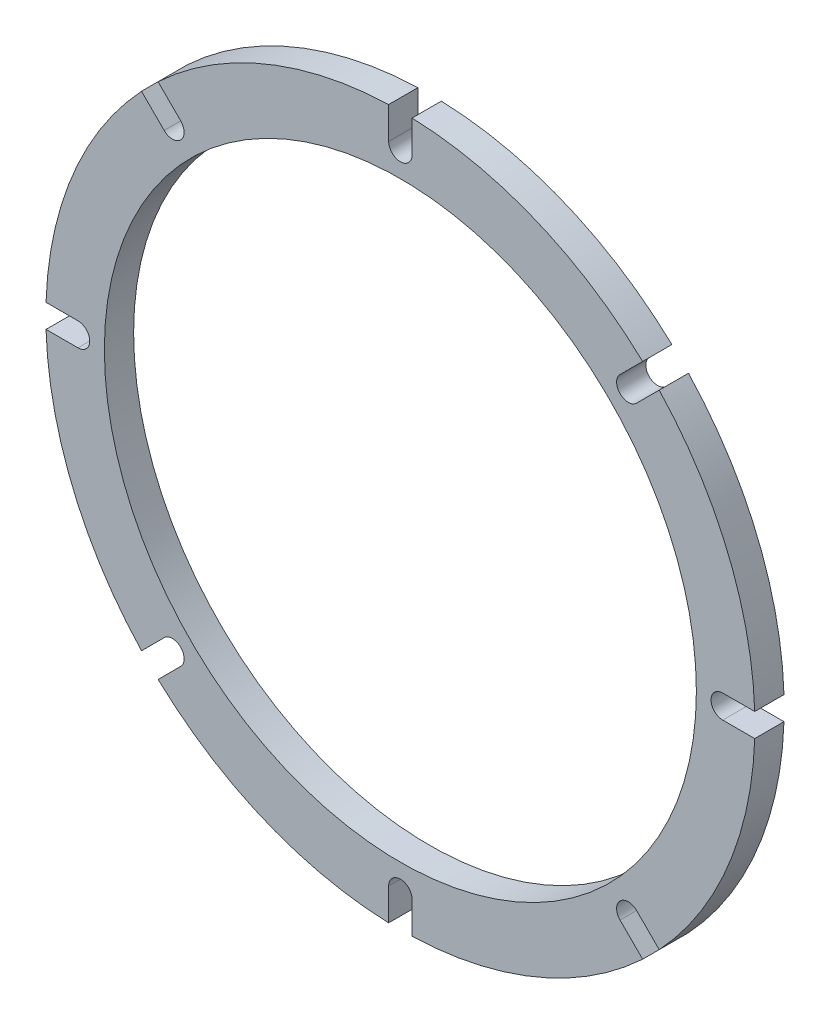
ISO-10303-21;
HEADER;
FILE_DESCRIPTION(('STEP AP214'),'2;1');
FILE_NAME('part.step','',(''),(''),'','','');
FILE_SCHEMA(('AUTOMOTIVE_DESIGN { 1 0 10303 214 1 1 1 1 }'));
ENDSEC;
DATA;
#1=APPLICATION_CONTEXT('core data for automotive mechanical design processes');
#2=APPLICATION_PROTOCOL_DEFINITION('international standard','automotive_design',2000,#1);
#3=PRODUCT_CONTEXT('',#1,'mechanical');
#4=PRODUCT('Part','Part','',(#3));
#5=PRODUCT_RELATED_PRODUCT_CATEGORY('part','',(#4));
#6=PRODUCT_DEFINITION_FORMATION('','',#4);
#7=PRODUCT_DEFINITION_CONTEXT('part definition',#1,'design');
#8=PRODUCT_DEFINITION('design','',#6,#7);
#9=PRODUCT_DEFINITION_SHAPE('','',#8);
#10=(LENGTH_UNIT() NAMED_UNIT(*) SI_UNIT(.MILLI.,.METRE.));
#11=(NAMED_UNIT(*) PLANE_ANGLE_UNIT() SI_UNIT($,.RADIAN.));
#12=(NAMED_UNIT(*) SI_UNIT($,.STERADIAN.) SOLID_ANGLE_UNIT());
#13=UNCERTAINTY_MEASURE_WITH_UNIT(LENGTH_MEASURE(1.E-05),#10,'distance_accuracy_value','');
#14=(GEOMETRIC_REPRESENTATION_CONTEXT(3) GLOBAL_UNCERTAINTY_ASSIGNED_CONTEXT((#13)) GLOBAL_UNIT_ASSIGNED_CONTEXT((#10,
#11,#12)) REPRESENTATION_CONTEXT('',''));
#15=CARTESIAN_POINT('',(0.,0.,0.));
#16=DIRECTION('',(0.,0.,1.));
#17=DIRECTION('',(1.,0.,0.));
#18=AXIS2_PLACEMENT_3D('',#15,#16,#17);
#19=CARTESIAN_POINT('',(0.,0.,10.));
#20=DIRECTION('',(0.,0.,1.));
#21=DIRECTION('',(1.,0.,0.));
#22=AXIS2_PLACEMENT_3D('',#19,#20,#21);
#23=PLANE('',#22);
#24=CARTESIAN_POINT('',(0.,0.,10.));
#25=DIRECTION('',(0.,0.,1.));
#26=DIRECTION('',(1.,0.,0.));
#27=AXIS2_PLACEMENT_3D('',#24,#25,#26);
#28=CIRCLE('',#27,101.15);
#29=CARTESIAN_POINT('',(101.15,0.,10.));
#30=VERTEX_POINT('',#29);
#31=EDGE_CURVE('E415',#30,#30,#28,.T.);
#32=ORIENTED_EDGE('',*,*,#31,.F.);
#33=EDGE_LOOP('',(#32));
#34=FACE_BOUND('',#33,.T.);
#35=CARTESIAN_POINT('',(0.,0.,10.));
#36=DIRECTION('',(0.,0.,1.));
#37=DIRECTION('',(1.,0.,0.));
#38=AXIS2_PLACEMENT_3D('',#35,#36,#37);
#39=CIRCLE('',#38,121.15);
#40=CARTESIAN_POINT('',(121.083948151685,4.00000000000127,10.));
#41=VERTEX_POINT('',#40);
#42=CARTESIAN_POINT('',(88.4477079556421,82.7908537061518,10.));
#43=VERTEX_POINT('',#42);
#44=EDGE_CURVE('E266',#41,#43,#39,.T.);
#45=ORIENTED_EDGE('',*,*,#44,.T.);
#46=DIRECTION('',(0.707106781186539,0.707106781186556,0.));
#47=VECTOR('',#46,1.);
#48=CARTESIAN_POINT('',(90.4049958559674,84.7481416064772,10.));
#49=LINE('',#48,#47);
#50=CARTESIAN_POINT('',(80.7162390724435,75.059384822953,10.));
#51=VERTEX_POINT('',#50);
#52=EDGE_CURVE('E254',#51,#43,#49,.T.);
#53=ORIENTED_EDGE('',*,*,#52,.F.);
#54=CARTESIAN_POINT('',(77.8878119476973,77.8878119476992,10.));
#55=DIRECTION('',(0.,0.,1.));
#56=DIRECTION('',(0.707106781186556,-0.707106781186539,0.));
#57=AXIS2_PLACEMENT_3D('',#54,#55,#56);
#58=CIRCLE('',#57,4.);
#59=CARTESIAN_POINT('',(75.059384822951,80.7162390724453,10.));
#60=VERTEX_POINT('',#59);
#61=EDGE_CURVE('E244',#60,#51,#58,.T.);
#62=ORIENTED_EDGE('',*,*,#61,.F.);
#63=DIRECTION('',(-0.707106781186539,-0.707106781186556,0.));
#64=VECTOR('',#63,1.);
#65=CARTESIAN_POINT('',(75.059384822951,80.7162390724453,10.));
#66=LINE('',#65,#64);
#67=CARTESIAN_POINT('',(82.7908537061497,88.4477079556441,10.));
#68=VERTEX_POINT('',#67);
#69=EDGE_CURVE('E267',#68,#60,#66,.T.);
#70=ORIENTED_EDGE('',*,*,#69,.F.);
#71=CARTESIAN_POINT('',(4.,121.083948151685,10.));
#72=VERTEX_POINT('',#71);
#73=EDGE_CURVE('E426',#68,#72,#39,.T.);
#74=ORIENTED_EDGE('',*,*,#73,.T.);
#75=DIRECTION('',(0.,1.,0.));
#76=VECTOR('',#75,1.);
#77=CARTESIAN_POINT('',(4.,123.851971245794,10.));
#78=LINE('',#77,#76);
#79=CARTESIAN_POINT('',(4.,110.15,10.));
#80=VERTEX_POINT('',#79);
#81=EDGE_CURVE('E396',#80,#72,#78,.T.);
#82=ORIENTED_EDGE('',*,*,#81,.F.);
#83=CARTESIAN_POINT('',(0.,110.15,10.));
#84=DIRECTION('',(0.,0.,1.));
#85=DIRECTION('',(1.,0.,0.));
#86=AXIS2_PLACEMENT_3D('',#83,#84,#85);
#87=CIRCLE('',#86,4.);
#88=CARTESIAN_POINT('',(-4.,110.15,10.));
#89=VERTEX_POINT('',#88);
#90=EDGE_CURVE('E394',#89,#80,#87,.T.);
#91=ORIENTED_EDGE('',*,*,#90,.F.);
#92=DIRECTION('',(0.,-1.,0.));
#93=VECTOR('',#92,1.);
#94=CARTESIAN_POINT('',(-4.,110.15,10.));
#95=LINE('',#94,#93);
#96=CARTESIAN_POINT('',(-4.,121.083948151685,10.));
#97=VERTEX_POINT('',#96);
#98=EDGE_CURVE('E400',#97,#89,#95,.T.);
#99=ORIENTED_EDGE('',*,*,#98,.F.);
#100=CARTESIAN_POINT('',(-82.7908537061509,88.447707955643,10.));
#101=VERTEX_POINT('',#100);
#102=EDGE_CURVE('E421',#97,#101,#39,.T.);
#103=ORIENTED_EDGE('',*,*,#102,.T.);
#104=DIRECTION('',(-0.707106781186549,0.707106781186546,0.));
#105=VECTOR('',#104,1.);
#106=CARTESIAN_POINT('',(-84.7481416064763,90.4049958559683,10.));
#107=LINE('',#106,#105);
#108=CARTESIAN_POINT('',(-75.0593848229522,80.7162390724443,10.));
#109=VERTEX_POINT('',#108);
#110=EDGE_CURVE('E376',#109,#101,#107,.T.);
#111=ORIENTED_EDGE('',*,*,#110,.F.);
#112=CARTESIAN_POINT('',(-77.8878119476984,77.8878119476981,10.));
#113=DIRECTION('',(0.,0.,1.));
#114=DIRECTION('',(0.707106781186546,0.707106781186549,0.));
#115=AXIS2_PLACEMENT_3D('',#112,#113,#114);
#116=CIRCLE('',#115,4.);
#117=CARTESIAN_POINT('',(-80.7162390724445,75.0593848229519,10.));
#118=VERTEX_POINT('',#117);
#119=EDGE_CURVE('E374',#118,#109,#116,.T.);
#120=ORIENTED_EDGE('',*,*,#119,.F.);
#121=DIRECTION('',(0.707106781186549,-0.707106781186546,0.));
#122=VECTOR('',#121,1.);
#123=CARTESIAN_POINT('',(-80.7162390724445,75.0593848229519,10.));
#124=LINE('',#123,#122);
#125=CARTESIAN_POINT('',(-88.4477079556433,82.7908537061506,10.));
#126=VERTEX_POINT('',#125);
#127=EDGE_CURVE('E379',#126,#118,#124,.T.);
#128=ORIENTED_EDGE('',*,*,#127,.F.);
#129=CARTESIAN_POINT('',(-121.083948151685,3.99999999999958,10.));
#130=VERTEX_POINT('',#129);
#131=EDGE_CURVE('E425',#126,#130,#39,.T.);
#132=ORIENTED_EDGE('',*,*,#131,.T.);
#133=DIRECTION('',(-1.,0.,0.));
#134=VECTOR('',#133,1.);
#135=CARTESIAN_POINT('',(-123.851971245794,3.99999999999957,10.));
#136=LINE('',#135,#134);
#137=CARTESIAN_POINT('',(-110.15,3.99999999999962,10.));
#138=VERTEX_POINT('',#137);
#139=EDGE_CURVE('E356',#138,#130,#136,.T.);
#140=ORIENTED_EDGE('',*,*,#139,.F.);
#141=CARTESIAN_POINT('',(-110.15,-3.84586669473571E-13,10.));
#142=DIRECTION('',(0.,0.,1.));
#143=DIRECTION('',(0.,1.,0.));
#144=AXIS2_PLACEMENT_3D('',#141,#142,#143);
#145=CIRCLE('',#144,4.);
#146=CARTESIAN_POINT('',(-110.15,-4.00000000000039,10.));
#147=VERTEX_POINT('',#146);
#148=EDGE_CURVE('E354',#147,#138,#145,.T.);
#149=ORIENTED_EDGE('',*,*,#148,.F.);
#150=DIRECTION('',(1.,0.,0.));
#151=VECTOR('',#150,1.);
#152=CARTESIAN_POINT('',(-110.15,-4.00000000000039,10.));
#153=LINE('',#152,#151);
#154=CARTESIAN_POINT('',(-121.083948151685,-4.00000000000042,10.));
#155=VERTEX_POINT('',#154);
#156=EDGE_CURVE('E359',#155,#147,#153,.T.);
#157=ORIENTED_EDGE('',*,*,#156,.F.);
#158=CARTESIAN_POINT('',(-88.4477079556427,-82.7908537061512,10.));
#159=VERTEX_POINT('',#158);
#160=EDGE_CURVE('E477',#155,#159,#39,.T.);
#161=ORIENTED_EDGE('',*,*,#160,.T.);
#162=DIRECTION('',(-0.707106781186544,-0.707106781186551,0.));
#163=VECTOR('',#162,1.);
#164=CARTESIAN_POINT('',(-90.404995855968,-84.7481416064766,10.));
#165=LINE('',#164,#163);
#166=CARTESIAN_POINT('',(-80.716239072444,-75.0593848229525,10.));
#167=VERTEX_POINT('',#166);
#168=EDGE_CURVE('E336',#167,#159,#165,.T.);
#169=ORIENTED_EDGE('',*,*,#168,.F.);
#170=CARTESIAN_POINT('',(-77.8878119476978,-77.8878119476986,10.));
#171=DIRECTION('',(0.,0.,1.));
#172=DIRECTION('',(-0.707106781186551,0.707106781186544,0.));
#173=AXIS2_PLACEMENT_3D('',#170,#171,#172);
#174=CIRCLE('',#173,4.);
#175=CARTESIAN_POINT('',(-75.0593848229516,-80.7162390724448,10.));
#176=VERTEX_POINT('',#175);
#177=EDGE_CURVE('E334',#176,#167,#174,.T.);
#178=ORIENTED_EDGE('',*,*,#177,.F.);
#179=DIRECTION('',(0.707106781186544,0.707106781186551,0.));
#180=VECTOR('',#179,1.);
#181=CARTESIAN_POINT('',(-75.0593848229516,-80.7162390724448,10.));
#182=LINE('',#181,#180);
#183=CARTESIAN_POINT('',(-82.7908537061503,-88.4477079556436,10.));
#184=VERTEX_POINT('',#183);
#185=EDGE_CURVE('E339',#184,#176,#182,.T.);
#186=ORIENTED_EDGE('',*,*,#185,.F.);
#187=CARTESIAN_POINT('',(-4.,-121.083948151685,10.));
#188=VERTEX_POINT('',#187);
#189=EDGE_CURVE('E472',#184,#188,#39,.T.);
#190=ORIENTED_EDGE('',*,*,#189,.T.);
#191=DIRECTION('',(0.,-1.,0.));
#192=VECTOR('',#191,1.);
#193=CARTESIAN_POINT('',(-4.,-123.851971245794,10.));
#194=LINE('',#193,#192);
#195=CARTESIAN_POINT('',(-4.,-110.15,10.));
#196=VERTEX_POINT('',#195);
#197=EDGE_CURVE('E316',#196,#188,#194,.T.);
#198=ORIENTED_EDGE('',*,*,#197,.F.);
#199=CARTESIAN_POINT('',(0.,-110.15,10.));
#200=DIRECTION('',(0.,0.,1.));
#201=DIRECTION('',(-1.,0.,0.));
#202=AXIS2_PLACEMENT_3D('',#199,#200,#201);
#203=CIRCLE('',#202,4.);
#204=CARTESIAN_POINT('',(4.,-110.15,10.));
#205=VERTEX_POINT('',#204);
#206=EDGE_CURVE('E314',#205,#196,#203,.T.);
#207=ORIENTED_EDGE('',*,*,#206,.F.);
#208=DIRECTION('',(0.,1.,0.));
#209=VECTOR('',#208,1.);
#210=CARTESIAN_POINT('',(4.,-110.15,10.));
#211=LINE('',#210,#209);
#212=CARTESIAN_POINT('',(4.,-121.083948151685,10.));
#213=VERTEX_POINT('',#212);
#214=EDGE_CURVE('E319',#213,#205,#211,.T.);
#215=ORIENTED_EDGE('',*,*,#214,.F.);
#216=CARTESIAN_POINT('',(82.7908537061515,-88.4477079556424,10.));
#217=VERTEX_POINT('',#216);
#218=EDGE_CURVE('E467',#213,#217,#39,.T.);
#219=ORIENTED_EDGE('',*,*,#218,.T.);
#220=DIRECTION('',(0.707106781186554,-0.707106781186541,0.));
#221=VECTOR('',#220,1.);
#222=CARTESIAN_POINT('',(84.7481416064769,-90.4049958559677,10.));
#223=LINE('',#222,#221);
#224=CARTESIAN_POINT('',(75.0593848229527,-80.7162390724438,10.));
#225=VERTEX_POINT('',#224);
#226=EDGE_CURVE('E296',#225,#217,#223,.T.);
#227=ORIENTED_EDGE('',*,*,#226,.F.);
#228=CARTESIAN_POINT('',(77.8878119476989,-77.8878119476975,10.));
#229=DIRECTION('',(0.,0.,1.));
#230=DIRECTION('',(-0.707106781186541,-0.707106781186554,0.));
#231=AXIS2_PLACEMENT_3D('',#228,#229,#230);
#232=CIRCLE('',#231,4.);
#233=CARTESIAN_POINT('',(80.7162390724451,-75.0593848229513,10.));
#234=VERTEX_POINT('',#233);
#235=EDGE_CURVE('E294',#234,#225,#232,.T.);
#236=ORIENTED_EDGE('',*,*,#235,.F.);
#237=DIRECTION('',(-0.707106781186554,0.707106781186541,0.));
#238=VECTOR('',#237,1.);
#239=CARTESIAN_POINT('',(80.7162390724451,-75.0593848229513,10.));
#240=LINE('',#239,#238);
#241=CARTESIAN_POINT('',(88.4477079556439,-82.79085370615,10.));
#242=VERTEX_POINT('',#241);
#243=EDGE_CURVE('E299',#242,#234,#240,.T.);
#244=ORIENTED_EDGE('',*,*,#243,.F.);
#245=CARTESIAN_POINT('',(121.083948151685,-3.99999999999873,10.));
#246=VERTEX_POINT('',#245);
#247=EDGE_CURVE('E465',#242,#246,#39,.T.);
#248=ORIENTED_EDGE('',*,*,#247,.T.);
#249=DIRECTION('',(1.,0.,0.));
#250=VECTOR('',#249,1.);
#251=CARTESIAN_POINT('',(123.851971245794,-3.9999999999987,10.));
#252=LINE('',#251,#250);
#253=CARTESIAN_POINT('',(110.15,-3.99999999999885,10.));
#254=VERTEX_POINT('',#253);
#255=EDGE_CURVE('E278',#254,#246,#252,.T.);
#256=ORIENTED_EDGE('',*,*,#255,.F.);
#257=CARTESIAN_POINT('',(110.15,1.15376000842071E-12,10.));
#258=DIRECTION('',(0.,0.,1.));
#259=DIRECTION('',(0.,-1.,0.));
#260=AXIS2_PLACEMENT_3D('',#257,#258,#259);
#261=CIRCLE('',#260,4.);
#262=CARTESIAN_POINT('',(110.15,4.00000000000115,10.));
#263=VERTEX_POINT('',#262);
#264=EDGE_CURVE('E276',#263,#254,#261,.T.);
#265=ORIENTED_EDGE('',*,*,#264,.F.);
#266=DIRECTION('',(-1.,0.,0.));
#267=VECTOR('',#266,1.);
#268=CARTESIAN_POINT('',(110.15,4.00000000000115,10.));
#269=LINE('',#268,#267);
#270=EDGE_CURVE('E280',#41,#263,#269,.T.);
#271=ORIENTED_EDGE('',*,*,#270,.F.);
#272=EDGE_LOOP('',(#45,#53,#62,#70,#74,#82,#91,#99,#103,#111,#120,#128,#132,#140,#149,#157,#161,
#169,#178,#186,#190,#198,#207,#215,#219,#227,#236,#244,#248,#256,#265,#271));
#273=FACE_BOUND('',#272,.T.);
#274=ADVANCED_FACE('F35',(#34,#273),#23,.T.);
#275=CARTESIAN_POINT('',(0.,0.,0.));
#276=DIRECTION('',(0.,0.,1.));
#277=DIRECTION('',(1.,0.,0.));
#278=AXIS2_PLACEMENT_3D('',#275,#276,#277);
#279=PLANE('',#278);
#280=CARTESIAN_POINT('',(0.,0.,0.));
#281=DIRECTION('',(0.,0.,1.));
#282=DIRECTION('',(1.,0.,0.));
#283=AXIS2_PLACEMENT_3D('',#280,#281,#282);
#284=CIRCLE('',#283,101.15);
#285=CARTESIAN_POINT('',(101.15,0.,0.));
#286=VERTEX_POINT('',#285);
#287=EDGE_CURVE('E414',#286,#286,#284,.T.);
#288=ORIENTED_EDGE('',*,*,#287,.T.);
#289=EDGE_LOOP('',(#288));
#290=FACE_BOUND('',#289,.T.);
#291=DIRECTION('',(0.707106781186539,0.707106781186556,0.));
#292=VECTOR('',#291,1.);
#293=CARTESIAN_POINT('',(90.4049958559674,84.7481416064772,0.));
#294=LINE('',#293,#292);
#295=CARTESIAN_POINT('',(80.7162390724435,75.059384822953,0.));
#296=VERTEX_POINT('',#295);
#297=CARTESIAN_POINT('',(88.4477079556421,82.7908537061518,0.));
#298=VERTEX_POINT('',#297);
#299=EDGE_CURVE('E260',#296,#298,#294,.T.);
#300=ORIENTED_EDGE('',*,*,#299,.T.);
#301=CARTESIAN_POINT('',(0.,0.,0.));
#302=DIRECTION('',(0.,0.,1.));
#303=DIRECTION('',(1.,0.,0.));
#304=AXIS2_PLACEMENT_3D('',#301,#302,#303);
#305=CIRCLE('',#304,121.15);
#306=CARTESIAN_POINT('',(121.083948151685,4.00000000000127,0.));
#307=VERTEX_POINT('',#306);
#308=EDGE_CURVE('E574',#307,#298,#305,.T.);
#309=ORIENTED_EDGE('',*,*,#308,.F.);
#310=DIRECTION('',(-1.,0.,0.));
#311=VECTOR('',#310,1.);
#312=CARTESIAN_POINT('',(110.15,4.00000000000115,0.));
#313=LINE('',#312,#311);
#314=CARTESIAN_POINT('',(110.15,4.00000000000115,0.));
#315=VERTEX_POINT('',#314);
#316=EDGE_CURVE('E58',#307,#315,#313,.T.);
#317=ORIENTED_EDGE('',*,*,#316,.T.);
#318=CARTESIAN_POINT('',(110.15,1.15376000842071E-12,0.));
#319=DIRECTION('',(0.,0.,1.));
#320=DIRECTION('',(0.,-1.,0.));
#321=AXIS2_PLACEMENT_3D('',#318,#319,#320);
#322=CIRCLE('',#321,4.);
#323=CARTESIAN_POINT('',(110.15,-3.99999999999885,0.));
#324=VERTEX_POINT('',#323);
#325=EDGE_CURVE('E261',#315,#324,#322,.T.);
#326=ORIENTED_EDGE('',*,*,#325,.T.);
#327=DIRECTION('',(1.,0.,0.));
#328=VECTOR('',#327,1.);
#329=CARTESIAN_POINT('',(123.851971245794,-3.9999999999987,0.));
#330=LINE('',#329,#328);
#331=CARTESIAN_POINT('',(121.083948151685,-3.99999999999873,0.));
#332=VERTEX_POINT('',#331);
#333=EDGE_CURVE('E285',#324,#332,#330,.T.);
#334=ORIENTED_EDGE('',*,*,#333,.T.);
#335=CARTESIAN_POINT('',(88.4477079556439,-82.79085370615,0.));
#336=VERTEX_POINT('',#335);
#337=EDGE_CURVE('E561',#336,#332,#305,.T.);
#338=ORIENTED_EDGE('',*,*,#337,.F.);
#339=DIRECTION('',(-0.707106781186554,0.707106781186541,0.));
#340=VECTOR('',#339,1.);
#341=CARTESIAN_POINT('',(80.7162390724451,-75.0593848229513,0.));
#342=LINE('',#341,#340);
#343=CARTESIAN_POINT('',(80.7162390724451,-75.0593848229513,0.));
#344=VERTEX_POINT('',#343);
#345=EDGE_CURVE('E297',#336,#344,#342,.T.);
#346=ORIENTED_EDGE('',*,*,#345,.T.);
#347=CARTESIAN_POINT('',(77.8878119476989,-77.8878119476975,0.));
#348=DIRECTION('',(0.,0.,1.));
#349=DIRECTION('',(-0.707106781186541,-0.707106781186554,0.));
#350=AXIS2_PLACEMENT_3D('',#347,#348,#349);
#351=CIRCLE('',#350,4.);
#352=CARTESIAN_POINT('',(75.0593848229527,-80.7162390724438,0.));
#353=VERTEX_POINT('',#352);
#354=EDGE_CURVE('E293',#344,#353,#351,.T.);
#355=ORIENTED_EDGE('',*,*,#354,.T.);
#356=DIRECTION('',(0.707106781186554,-0.707106781186541,0.));
#357=VECTOR('',#356,1.);
#358=CARTESIAN_POINT('',(84.7481416064769,-90.4049958559677,0.));
#359=LINE('',#358,#357);
#360=CARTESIAN_POINT('',(82.7908537061515,-88.4477079556424,0.));
#361=VERTEX_POINT('',#360);
#362=EDGE_CURVE('E304',#353,#361,#359,.T.);
#363=ORIENTED_EDGE('',*,*,#362,.T.);
#364=CARTESIAN_POINT('',(4.,-121.083948151685,0.));
#365=VERTEX_POINT('',#364);
#366=EDGE_CURVE('E545',#365,#361,#305,.T.);
#367=ORIENTED_EDGE('',*,*,#366,.F.);
#368=DIRECTION('',(0.,1.,0.));
#369=VECTOR('',#368,1.);
#370=CARTESIAN_POINT('',(4.,-110.15,0.));
#371=LINE('',#370,#369);
#372=CARTESIAN_POINT('',(4.,-110.15,0.));
#373=VERTEX_POINT('',#372);
#374=EDGE_CURVE('E317',#365,#373,#371,.T.);
#375=ORIENTED_EDGE('',*,*,#374,.T.);
#376=CARTESIAN_POINT('',(0.,-110.15,0.));
#377=DIRECTION('',(0.,0.,1.));
#378=DIRECTION('',(-1.,0.,0.));
#379=AXIS2_PLACEMENT_3D('',#376,#377,#378);
#380=CIRCLE('',#379,4.);
#381=CARTESIAN_POINT('',(-4.,-110.15,0.));
#382=VERTEX_POINT('',#381);
#383=EDGE_CURVE('E313',#373,#382,#380,.T.);
#384=ORIENTED_EDGE('',*,*,#383,.T.);
#385=DIRECTION('',(0.,-1.,0.));
#386=VECTOR('',#385,1.);
#387=CARTESIAN_POINT('',(-4.,-123.851971245794,0.));
#388=LINE('',#387,#386);
#389=CARTESIAN_POINT('',(-4.,-121.083948151685,0.));
#390=VERTEX_POINT('',#389);
#391=EDGE_CURVE('E324',#382,#390,#388,.T.);
#392=ORIENTED_EDGE('',*,*,#391,.T.);
#393=CARTESIAN_POINT('',(-82.7908537061503,-88.4477079556436,0.));
#394=VERTEX_POINT('',#393);
#395=EDGE_CURVE('E529',#394,#390,#305,.T.);
#396=ORIENTED_EDGE('',*,*,#395,.F.);
#397=DIRECTION('',(0.707106781186544,0.707106781186551,0.));
#398=VECTOR('',#397,1.);
#399=CARTESIAN_POINT('',(-75.0593848229516,-80.7162390724448,0.));
#400=LINE('',#399,#398);
#401=CARTESIAN_POINT('',(-75.0593848229516,-80.7162390724448,0.));
#402=VERTEX_POINT('',#401);
#403=EDGE_CURVE('E337',#394,#402,#400,.T.);
#404=ORIENTED_EDGE('',*,*,#403,.T.);
#405=CARTESIAN_POINT('',(-77.8878119476978,-77.8878119476986,0.));
#406=DIRECTION('',(0.,0.,1.));
#407=DIRECTION('',(-0.707106781186551,0.707106781186544,0.));
#408=AXIS2_PLACEMENT_3D('',#405,#406,#407);
#409=CIRCLE('',#408,4.);
#410=CARTESIAN_POINT('',(-80.716239072444,-75.0593848229525,0.));
#411=VERTEX_POINT('',#410);
#412=EDGE_CURVE('E333',#402,#411,#409,.T.);
#413=ORIENTED_EDGE('',*,*,#412,.T.);
#414=DIRECTION('',(-0.707106781186544,-0.707106781186551,0.));
#415=VECTOR('',#414,1.);
#416=CARTESIAN_POINT('',(-90.404995855968,-84.7481416064766,0.));
#417=LINE('',#416,#415);
#418=CARTESIAN_POINT('',(-88.4477079556427,-82.7908537061512,0.));
#419=VERTEX_POINT('',#418);
#420=EDGE_CURVE('E344',#411,#419,#417,.T.);
#421=ORIENTED_EDGE('',*,*,#420,.T.);
#422=CARTESIAN_POINT('',(-121.083948151685,-4.00000000000042,0.));
#423=VERTEX_POINT('',#422);
#424=EDGE_CURVE('E513',#423,#419,#305,.T.);
#425=ORIENTED_EDGE('',*,*,#424,.F.);
#426=DIRECTION('',(1.,0.,0.));
#427=VECTOR('',#426,1.);
#428=CARTESIAN_POINT('',(-110.15,-4.00000000000039,0.));
#429=LINE('',#428,#427);
#430=CARTESIAN_POINT('',(-110.15,-4.00000000000039,0.));
#431=VERTEX_POINT('',#430);
#432=EDGE_CURVE('E357',#423,#431,#429,.T.);
#433=ORIENTED_EDGE('',*,*,#432,.T.);
#434=CARTESIAN_POINT('',(-110.15,-3.84586669473571E-13,0.));
#435=DIRECTION('',(0.,0.,1.));
#436=DIRECTION('',(0.,1.,0.));
#437=AXIS2_PLACEMENT_3D('',#434,#435,#436);
#438=CIRCLE('',#437,4.);
#439=CARTESIAN_POINT('',(-110.15,3.99999999999962,0.));
#440=VERTEX_POINT('',#439);
#441=EDGE_CURVE('E353',#431,#440,#438,.T.);
#442=ORIENTED_EDGE('',*,*,#441,.T.);
#443=DIRECTION('',(-1.,0.,0.));
#444=VECTOR('',#443,1.);
#445=CARTESIAN_POINT('',(-123.851971245794,3.99999999999957,0.));
#446=LINE('',#445,#444);
#447=CARTESIAN_POINT('',(-121.083948151685,3.99999999999958,0.));
#448=VERTEX_POINT('',#447);
#449=EDGE_CURVE('E364',#440,#448,#446,.T.);
#450=ORIENTED_EDGE('',*,*,#449,.T.);
#451=CARTESIAN_POINT('',(-88.4477079556433,82.7908537061507,0.));
#452=VERTEX_POINT('',#451);
#453=EDGE_CURVE('E430',#452,#448,#305,.T.);
#454=ORIENTED_EDGE('',*,*,#453,.F.);
#455=DIRECTION('',(0.707106781186549,-0.707106781186546,0.));
#456=VECTOR('',#455,1.);
#457=CARTESIAN_POINT('',(-80.7162390724445,75.0593848229519,0.));
#458=LINE('',#457,#456);
#459=CARTESIAN_POINT('',(-80.7162390724445,75.0593848229519,0.));
#460=VERTEX_POINT('',#459);
#461=EDGE_CURVE('E377',#452,#460,#458,.T.);
#462=ORIENTED_EDGE('',*,*,#461,.T.);
#463=CARTESIAN_POINT('',(-77.8878119476984,77.8878119476981,0.));
#464=DIRECTION('',(0.,0.,1.));
#465=DIRECTION('',(0.707106781186546,0.707106781186549,0.));
#466=AXIS2_PLACEMENT_3D('',#463,#464,#465);
#467=CIRCLE('',#466,4.);
#468=CARTESIAN_POINT('',(-75.0593848229522,80.7162390724443,0.));
#469=VERTEX_POINT('',#468);
#470=EDGE_CURVE('E373',#460,#469,#467,.T.);
#471=ORIENTED_EDGE('',*,*,#470,.T.);
#472=DIRECTION('',(-0.707106781186549,0.707106781186546,0.));
#473=VECTOR('',#472,1.);
#474=CARTESIAN_POINT('',(-84.7481416064763,90.4049958559683,0.));
#475=LINE('',#474,#473);
#476=CARTESIAN_POINT('',(-82.7908537061509,88.447707955643,0.));
#477=VERTEX_POINT('',#476);
#478=EDGE_CURVE('E384',#469,#477,#475,.T.);
#479=ORIENTED_EDGE('',*,*,#478,.T.);
#480=CARTESIAN_POINT('',(-4.,121.083948151685,0.));
#481=VERTEX_POINT('',#480);
#482=EDGE_CURVE('E427',#481,#477,#305,.T.);
#483=ORIENTED_EDGE('',*,*,#482,.F.);
#484=DIRECTION('',(0.,-1.,0.));
#485=VECTOR('',#484,1.);
#486=CARTESIAN_POINT('',(-4.,110.15,0.));
#487=LINE('',#486,#485);
#488=CARTESIAN_POINT('',(-4.,110.15,0.));
#489=VERTEX_POINT('',#488);
#490=EDGE_CURVE('E397',#481,#489,#487,.T.);
#491=ORIENTED_EDGE('',*,*,#490,.T.);
#492=CARTESIAN_POINT('',(0.,110.15,0.));
#493=DIRECTION('',(0.,0.,1.));
#494=DIRECTION('',(1.,0.,0.));
#495=AXIS2_PLACEMENT_3D('',#492,#493,#494);
#496=CIRCLE('',#495,4.);
#497=CARTESIAN_POINT('',(4.,110.15,0.));
#498=VERTEX_POINT('',#497);
#499=EDGE_CURVE('E393',#489,#498,#496,.T.);
#500=ORIENTED_EDGE('',*,*,#499,.T.);
#501=DIRECTION('',(0.,1.,0.));
#502=VECTOR('',#501,1.);
#503=CARTESIAN_POINT('',(4.,123.851971245794,0.));
#504=LINE('',#503,#502);
#505=CARTESIAN_POINT('',(4.,121.083948151685,0.));
#506=VERTEX_POINT('',#505);
#507=EDGE_CURVE('E405',#498,#506,#504,.T.);
#508=ORIENTED_EDGE('',*,*,#507,.T.);
#509=CARTESIAN_POINT('',(82.7908537061497,88.4477079556442,0.));
#510=VERTEX_POINT('',#509);
#511=EDGE_CURVE('E418',#510,#506,#305,.T.);
#512=ORIENTED_EDGE('',*,*,#511,.F.);
#513=DIRECTION('',(-0.707106781186539,-0.707106781186556,0.));
#514=VECTOR('',#513,1.);
#515=CARTESIAN_POINT('',(75.059384822951,80.7162390724453,0.));
#516=LINE('',#515,#514);
#517=CARTESIAN_POINT('',(75.059384822951,80.7162390724453,0.));
#518=VERTEX_POINT('',#517);
#519=EDGE_CURVE('E50',#510,#518,#516,.T.);
#520=ORIENTED_EDGE('',*,*,#519,.T.);
#521=CARTESIAN_POINT('',(77.8878119476973,77.8878119476992,0.));
#522=DIRECTION('',(0.,0.,1.));
#523=DIRECTION('',(0.707106781186556,-0.707106781186539,0.));
#524=AXIS2_PLACEMENT_3D('',#521,#522,#523);
#525=CIRCLE('',#524,4.);
#526=EDGE_CURVE('E271',#518,#296,#525,.T.);
#527=ORIENTED_EDGE('',*,*,#526,.T.);
#528=EDGE_LOOP('',(#300,#309,#317,#326,#334,#338,#346,#355,#363,#367,#375,#384,#392,#396,#404,
#413,#421,#425,#433,#442,#450,#454,#462,#471,#479,#483,#491,#500,#508,#512,#520,#527));
#529=FACE_BOUND('',#528,.T.);
#530=ADVANCED_FACE('F501',(#290,#529),#279,.F.);
#531=CARTESIAN_POINT('',(0.,0.,10.));
#532=DIRECTION('',(0.,0.,-1.));
#533=DIRECTION('',(-1.,0.,0.));
#534=AXIS2_PLACEMENT_3D('',#531,#532,#533);
#535=CYLINDRICAL_SURFACE('',#534,121.15);
#536=DIRECTION('',(0.,0.,-1.));
#537=VECTOR('',#536,1.);
#538=CARTESIAN_POINT('',(88.4477079556421,82.7908537061519,10.));
#539=LINE('',#538,#537);
#540=EDGE_CURVE('E11',#43,#298,#539,.T.);
#541=ORIENTED_EDGE('',*,*,#540,.F.);
#542=ORIENTED_EDGE('',*,*,#44,.F.);
#543=DIRECTION('',(0.,0.,-1.));
#544=VECTOR('',#543,1.);
#545=CARTESIAN_POINT('',(121.083948151685,4.00000000000127,10.));
#546=LINE('',#545,#544);
#547=EDGE_CURVE('E455',#307,#41,#546,.F.);
#548=ORIENTED_EDGE('',*,*,#547,.F.);
#549=ORIENTED_EDGE('',*,*,#308,.T.);
#550=EDGE_LOOP('',(#541,#542,#548,#549));
#551=FACE_BOUND('',#550,.T.);
#552=ADVANCED_FACE('F572',(#551),#535,.T.);
#553=DIRECTION('',(0.,0.,-1.));
#554=VECTOR('',#553,1.);
#555=CARTESIAN_POINT('',(82.7908537061497,88.4477079556442,10.));
#556=LINE('',#555,#554);
#557=EDGE_CURVE('E43',#510,#68,#556,.F.);
#558=ORIENTED_EDGE('',*,*,#557,.F.);
#559=ORIENTED_EDGE('',*,*,#511,.T.);
#560=DIRECTION('',(0.,0.,-1.));
#561=VECTOR('',#560,1.);
#562=CARTESIAN_POINT('',(4.,121.083948151685,10.));
#563=LINE('',#562,#561);
#564=EDGE_CURVE('E432',#72,#506,#563,.T.);
#565=ORIENTED_EDGE('',*,*,#564,.F.);
#566=ORIENTED_EDGE('',*,*,#73,.F.);
#567=EDGE_LOOP('',(#558,#559,#565,#566));
#568=FACE_BOUND('',#567,.T.);
#569=ADVANCED_FACE('F464',(#568),#535,.T.);
#570=DIRECTION('',(0.,0.,-1.));
#571=VECTOR('',#570,1.);
#572=CARTESIAN_POINT('',(121.083948151685,-3.99999999999873,10.));
#573=LINE('',#572,#571);
#574=EDGE_CURVE('E457',#246,#332,#573,.T.);
#575=ORIENTED_EDGE('',*,*,#574,.F.);
#576=ORIENTED_EDGE('',*,*,#247,.F.);
#577=DIRECTION('',(0.,0.,-1.));
#578=VECTOR('',#577,1.);
#579=CARTESIAN_POINT('',(88.4477079556439,-82.79085370615,10.));
#580=LINE('',#579,#578);
#581=EDGE_CURVE('E451',#336,#242,#580,.F.);
#582=ORIENTED_EDGE('',*,*,#581,.F.);
#583=ORIENTED_EDGE('',*,*,#337,.T.);
#584=EDGE_LOOP('',(#575,#576,#582,#583));
#585=FACE_BOUND('',#584,.T.);
#586=ADVANCED_FACE('F559',(#585),#535,.T.);
#587=DIRECTION('',(0.,0.,-1.));
#588=VECTOR('',#587,1.);
#589=CARTESIAN_POINT('',(82.7908537061515,-88.4477079556424,10.));
#590=LINE('',#589,#588);
#591=EDGE_CURVE('E453',#217,#361,#590,.T.);
#592=ORIENTED_EDGE('',*,*,#591,.F.);
#593=ORIENTED_EDGE('',*,*,#218,.F.);
#594=DIRECTION('',(0.,0.,-1.));
#595=VECTOR('',#594,1.);
#596=CARTESIAN_POINT('',(4.,-121.083948151685,10.));
#597=LINE('',#596,#595);
#598=EDGE_CURVE('E447',#365,#213,#597,.F.);
#599=ORIENTED_EDGE('',*,*,#598,.F.);
#600=ORIENTED_EDGE('',*,*,#366,.T.);
#601=EDGE_LOOP('',(#592,#593,#599,#600));
#602=FACE_BOUND('',#601,.T.);
#603=ADVANCED_FACE('F543',(#602),#535,.T.);
#604=DIRECTION('',(0.,0.,-1.));
#605=VECTOR('',#604,1.);
#606=CARTESIAN_POINT('',(-4.,-121.083948151685,10.));
#607=LINE('',#606,#605);
#608=EDGE_CURVE('E449',#188,#390,#607,.T.);
#609=ORIENTED_EDGE('',*,*,#608,.F.);
#610=ORIENTED_EDGE('',*,*,#189,.F.);
#611=DIRECTION('',(0.,0.,-1.));
#612=VECTOR('',#611,1.);
#613=CARTESIAN_POINT('',(-82.7908537061503,-88.4477079556436,10.));
#614=LINE('',#613,#612);
#615=EDGE_CURVE('E443',#394,#184,#614,.F.);
#616=ORIENTED_EDGE('',*,*,#615,.F.);
#617=ORIENTED_EDGE('',*,*,#395,.T.);
#618=EDGE_LOOP('',(#609,#610,#616,#617));
#619=FACE_BOUND('',#618,.T.);
#620=ADVANCED_FACE('F527',(#619),#535,.T.);
#621=DIRECTION('',(0.,0.,-1.));
#622=VECTOR('',#621,1.);
#623=CARTESIAN_POINT('',(-88.4477079556427,-82.7908537061512,10.));
#624=LINE('',#623,#622);
#625=EDGE_CURVE('E445',#159,#419,#624,.T.);
#626=ORIENTED_EDGE('',*,*,#625,.F.);
#627=ORIENTED_EDGE('',*,*,#160,.F.);
#628=DIRECTION('',(0.,0.,-1.));
#629=VECTOR('',#628,1.);
#630=CARTESIAN_POINT('',(-121.083948151685,-4.00000000000042,10.));
#631=LINE('',#630,#629);
#632=EDGE_CURVE('E439',#423,#155,#631,.F.);
#633=ORIENTED_EDGE('',*,*,#632,.F.);
#634=ORIENTED_EDGE('',*,*,#424,.T.);
#635=EDGE_LOOP('',(#626,#627,#633,#634));
#636=FACE_BOUND('',#635,.T.);
#637=ADVANCED_FACE('F511',(#636),#535,.T.);
#638=DIRECTION('',(0.,0.,-1.));
#639=VECTOR('',#638,1.);
#640=CARTESIAN_POINT('',(-121.083948151685,3.99999999999958,10.));
#641=LINE('',#640,#639);
#642=EDGE_CURVE('E441',#130,#448,#641,.T.);
#643=ORIENTED_EDGE('',*,*,#642,.F.);
#644=ORIENTED_EDGE('',*,*,#131,.F.);
#645=DIRECTION('',(0.,0.,-1.));
#646=VECTOR('',#645,1.);
#647=CARTESIAN_POINT('',(-88.4477079556433,82.7908537061506,10.));
#648=LINE('',#647,#646);
#649=EDGE_CURVE('E435',#452,#126,#648,.F.);
#650=ORIENTED_EDGE('',*,*,#649,.F.);
#651=ORIENTED_EDGE('',*,*,#453,.T.);
#652=EDGE_LOOP('',(#643,#644,#650,#651));
#653=FACE_BOUND('',#652,.T.);
#654=ADVANCED_FACE('F494',(#653),#535,.T.);
#655=DIRECTION('',(0.,0.,-1.));
#656=VECTOR('',#655,1.);
#657=CARTESIAN_POINT('',(-82.7908537061509,88.447707955643,10.));
#658=LINE('',#657,#656);
#659=EDGE_CURVE('E437',#101,#477,#658,.T.);
#660=ORIENTED_EDGE('',*,*,#659,.F.);
#661=ORIENTED_EDGE('',*,*,#102,.F.);
#662=DIRECTION('',(0.,0.,-1.));
#663=VECTOR('',#662,1.);
#664=CARTESIAN_POINT('',(-4.,121.083948151685,10.));
#665=LINE('',#664,#663);
#666=EDGE_CURVE('E424',#481,#97,#665,.F.);
#667=ORIENTED_EDGE('',*,*,#666,.F.);
#668=ORIENTED_EDGE('',*,*,#482,.T.);
#669=EDGE_LOOP('',(#660,#661,#667,#668));
#670=FACE_BOUND('',#669,.T.);
#671=ADVANCED_FACE('F37',(#670),#535,.T.);
#672=CARTESIAN_POINT('',(0.,0.,10.));
#673=DIRECTION('',(0.,0.,-1.));
#674=DIRECTION('',(-1.,0.,0.));
#675=AXIS2_PLACEMENT_3D('',#672,#673,#674);
#676=CYLINDRICAL_SURFACE('',#675,101.15);
#677=ORIENTED_EDGE('',*,*,#31,.T.);
#678=EDGE_LOOP('',(#677));
#679=FACE_BOUND('',#678,.T.);
#680=ORIENTED_EDGE('',*,*,#287,.F.);
#681=EDGE_LOOP('',(#680));
#682=FACE_BOUND('',#681,.T.);
#683=ADVANCED_FACE('F619',(#679,#682),#676,.F.);
#684=CARTESIAN_POINT('',(4.,123.851971245794,10.));
#685=DIRECTION('',(-1.,0.,0.));
#686=DIRECTION('',(0.,0.,1.));
#687=AXIS2_PLACEMENT_3D('',#684,#685,#686);
#688=PLANE('',#687);
#689=ORIENTED_EDGE('',*,*,#564,.T.);
#690=ORIENTED_EDGE('',*,*,#507,.F.);
#691=DIRECTION('',(0.,0.,-1.));
#692=VECTOR('',#691,1.);
#693=CARTESIAN_POINT('',(4.,110.15,10.));
#694=LINE('',#693,#692);
#695=EDGE_CURVE('E411',#80,#498,#694,.T.);
#696=ORIENTED_EDGE('',*,*,#695,.F.);
#697=ORIENTED_EDGE('',*,*,#81,.T.);
#698=EDGE_LOOP('',(#689,#690,#696,#697));
#699=FACE_BOUND('',#698,.T.);
#700=ADVANCED_FACE('F576',(#699),#688,.T.);
#701=CARTESIAN_POINT('',(-4.,110.15,10.));
#702=DIRECTION('',(1.,0.,0.));
#703=DIRECTION('',(0.,0.,-1.));
#704=AXIS2_PLACEMENT_3D('',#701,#702,#703);
#705=PLANE('',#704);
#706=ORIENTED_EDGE('',*,*,#666,.T.);
#707=ORIENTED_EDGE('',*,*,#98,.T.);
#708=DIRECTION('',(0.,0.,-1.));
#709=VECTOR('',#708,1.);
#710=CARTESIAN_POINT('',(-4.,110.15,10.));
#711=LINE('',#710,#709);
#712=EDGE_CURVE('E402',#89,#489,#711,.T.);
#713=ORIENTED_EDGE('',*,*,#712,.T.);
#714=ORIENTED_EDGE('',*,*,#490,.F.);
#715=EDGE_LOOP('',(#706,#707,#713,#714));
#716=FACE_BOUND('',#715,.T.);
#717=ADVANCED_FACE('F586',(#716),#705,.T.);
#718=CARTESIAN_POINT('',(0.,110.15,10.));
#719=DIRECTION('',(0.,0.,-1.));
#720=DIRECTION('',(-1.,0.,0.));
#721=AXIS2_PLACEMENT_3D('',#718,#719,#720);
#722=CYLINDRICAL_SURFACE('',#721,4.);
#723=ORIENTED_EDGE('',*,*,#499,.F.);
#724=ORIENTED_EDGE('',*,*,#712,.F.);
#725=ORIENTED_EDGE('',*,*,#90,.T.);
#726=ORIENTED_EDGE('',*,*,#695,.T.);
#727=EDGE_LOOP('',(#723,#724,#725,#726));
#728=FACE_BOUND('',#727,.T.);
#729=ADVANCED_FACE('F584',(#728),#722,.F.);
#730=CARTESIAN_POINT('',(-84.7481416064763,90.4049958559683,10.));
#731=DIRECTION('',(-0.707106781186546,-0.707106781186549,0.));
#732=DIRECTION('',(0.707106781186549,-0.707106781186546,0.));
#733=AXIS2_PLACEMENT_3D('',#730,#731,#732);
#734=PLANE('',#733);
#735=ORIENTED_EDGE('',*,*,#659,.T.);
#736=ORIENTED_EDGE('',*,*,#478,.F.);
#737=DIRECTION('',(0.,0.,-1.));
#738=VECTOR('',#737,1.);
#739=CARTESIAN_POINT('',(-75.0593848229522,80.7162390724443,10.));
#740=LINE('',#739,#738);
#741=EDGE_CURVE('E390',#109,#469,#740,.T.);
#742=ORIENTED_EDGE('',*,*,#741,.F.);
#743=ORIENTED_EDGE('',*,*,#110,.T.);
#744=EDGE_LOOP('',(#735,#736,#742,#743));
#745=FACE_BOUND('',#744,.T.);
#746=ADVANCED_FACE('F594',(#745),#734,.T.);
#747=CARTESIAN_POINT('',(-80.7162390724445,75.0593848229519,10.));
#748=DIRECTION('',(0.707106781186546,0.707106781186549,0.));
#749=DIRECTION('',(-0.707106781186549,0.707106781186546,0.));
#750=AXIS2_PLACEMENT_3D('',#747,#748,#749);
#751=PLANE('',#750);
#752=ORIENTED_EDGE('',*,*,#649,.T.);
#753=ORIENTED_EDGE('',*,*,#127,.T.);
#754=DIRECTION('',(0.,0.,-1.));
#755=VECTOR('',#754,1.);
#756=CARTESIAN_POINT('',(-80.7162390724445,75.0593848229519,10.));
#757=LINE('',#756,#755);
#758=EDGE_CURVE('E381',#118,#460,#757,.T.);
#759=ORIENTED_EDGE('',*,*,#758,.T.);
#760=ORIENTED_EDGE('',*,*,#461,.F.);
#761=EDGE_LOOP('',(#752,#753,#759,#760));
#762=FACE_BOUND('',#761,.T.);
#763=ADVANCED_FACE('F600',(#762),#751,.T.);
#764=CARTESIAN_POINT('',(-77.8878119476984,77.8878119476981,10.));
#765=DIRECTION('',(0.,0.,-1.));
#766=DIRECTION('',(-1.,0.,0.));
#767=AXIS2_PLACEMENT_3D('',#764,#765,#766);
#768=CYLINDRICAL_SURFACE('',#767,4.);
#769=ORIENTED_EDGE('',*,*,#470,.F.);
#770=ORIENTED_EDGE('',*,*,#758,.F.);
#771=ORIENTED_EDGE('',*,*,#119,.T.);
#772=ORIENTED_EDGE('',*,*,#741,.T.);
#773=EDGE_LOOP('',(#769,#770,#771,#772));
#774=FACE_BOUND('',#773,.T.);
#775=ADVANCED_FACE('F597',(#774),#768,.F.);
#776=CARTESIAN_POINT('',(-123.851971245794,3.99999999999957,10.));
#777=DIRECTION('',(0.,-1.,0.));
#778=DIRECTION('',(1.,0.,0.));
#779=AXIS2_PLACEMENT_3D('',#776,#777,#778);
#780=PLANE('',#779);
#781=ORIENTED_EDGE('',*,*,#642,.T.);
#782=ORIENTED_EDGE('',*,*,#449,.F.);
#783=DIRECTION('',(0.,0.,-1.));
#784=VECTOR('',#783,1.);
#785=CARTESIAN_POINT('',(-110.15,3.99999999999962,10.));
#786=LINE('',#785,#784);
#787=EDGE_CURVE('E370',#138,#440,#786,.T.);
#788=ORIENTED_EDGE('',*,*,#787,.F.);
#789=ORIENTED_EDGE('',*,*,#139,.T.);
#790=EDGE_LOOP('',(#781,#782,#788,#789));
#791=FACE_BOUND('',#790,.T.);
#792=ADVANCED_FACE('F498',(#791),#780,.T.);
#793=CARTESIAN_POINT('',(-110.15,-4.00000000000039,10.));
#794=DIRECTION('',(0.,1.,0.));
#795=DIRECTION('',(-1.,0.,0.));
#796=AXIS2_PLACEMENT_3D('',#793,#794,#795);
#797=PLANE('',#796);
#798=ORIENTED_EDGE('',*,*,#632,.T.);
#799=ORIENTED_EDGE('',*,*,#156,.T.);
#800=DIRECTION('',(0.,0.,-1.));
#801=VECTOR('',#800,1.);
#802=CARTESIAN_POINT('',(-110.15,-4.00000000000039,10.));
#803=LINE('',#802,#801);
#804=EDGE_CURVE('E361',#147,#431,#803,.T.);
#805=ORIENTED_EDGE('',*,*,#804,.T.);
#806=ORIENTED_EDGE('',*,*,#432,.F.);
#807=EDGE_LOOP('',(#798,#799,#805,#806));
#808=FACE_BOUND('',#807,.T.);
#809=ADVANCED_FACE('F665',(#808),#797,.T.);
#810=CARTESIAN_POINT('',(-110.15,-3.84586669473571E-13,10.));
#811=DIRECTION('',(0.,0.,-1.));
#812=DIRECTION('',(-1.,0.,0.));
#813=AXIS2_PLACEMENT_3D('',#810,#811,#812);
#814=CYLINDRICAL_SURFACE('',#813,4.);
#815=ORIENTED_EDGE('',*,*,#441,.F.);
#816=ORIENTED_EDGE('',*,*,#804,.F.);
#817=ORIENTED_EDGE('',*,*,#148,.T.);
#818=ORIENTED_EDGE('',*,*,#787,.T.);
#819=EDGE_LOOP('',(#815,#816,#817,#818));
#820=FACE_BOUND('',#819,.T.);
#821=ADVANCED_FACE('F506',(#820),#814,.F.);
#822=CARTESIAN_POINT('',(-90.404995855968,-84.7481416064766,10.));
#823=DIRECTION('',(0.707106781186551,-0.707106781186544,0.));
#824=DIRECTION('',(0.707106781186544,0.707106781186551,0.));
#825=AXIS2_PLACEMENT_3D('',#822,#823,#824);
#826=PLANE('',#825);
#827=ORIENTED_EDGE('',*,*,#625,.T.);
#828=ORIENTED_EDGE('',*,*,#420,.F.);
#829=DIRECTION('',(0.,0.,-1.));
#830=VECTOR('',#829,1.);
#831=CARTESIAN_POINT('',(-80.716239072444,-75.0593848229525,10.));
#832=LINE('',#831,#830);
#833=EDGE_CURVE('E350',#167,#411,#832,.T.);
#834=ORIENTED_EDGE('',*,*,#833,.F.);
#835=ORIENTED_EDGE('',*,*,#168,.T.);
#836=EDGE_LOOP('',(#827,#828,#834,#835));
#837=FACE_BOUND('',#836,.T.);
#838=ADVANCED_FACE('F515',(#837),#826,.T.);
#839=CARTESIAN_POINT('',(-75.0593848229516,-80.7162390724448,10.));
#840=DIRECTION('',(-0.707106781186551,0.707106781186544,0.));
#841=DIRECTION('',(-0.707106781186544,-0.707106781186551,0.));
#842=AXIS2_PLACEMENT_3D('',#839,#840,#841);
#843=PLANE('',#842);
#844=ORIENTED_EDGE('',*,*,#615,.T.);
#845=ORIENTED_EDGE('',*,*,#185,.T.);
#846=DIRECTION('',(0.,0.,-1.));
#847=VECTOR('',#846,1.);
#848=CARTESIAN_POINT('',(-75.0593848229516,-80.7162390724448,10.));
#849=LINE('',#848,#847);
#850=EDGE_CURVE('E341',#176,#402,#849,.T.);
#851=ORIENTED_EDGE('',*,*,#850,.T.);
#852=ORIENTED_EDGE('',*,*,#403,.F.);
#853=EDGE_LOOP('',(#844,#845,#851,#852));
#854=FACE_BOUND('',#853,.T.);
#855=ADVANCED_FACE('F689',(#854),#843,.T.);
#856=CARTESIAN_POINT('',(-77.8878119476978,-77.8878119476986,10.));
#857=DIRECTION('',(0.,0.,-1.));
#858=DIRECTION('',(-1.,0.,0.));
#859=AXIS2_PLACEMENT_3D('',#856,#857,#858);
#860=CYLINDRICAL_SURFACE('',#859,4.);
#861=ORIENTED_EDGE('',*,*,#412,.F.);
#862=ORIENTED_EDGE('',*,*,#850,.F.);
#863=ORIENTED_EDGE('',*,*,#177,.T.);
#864=ORIENTED_EDGE('',*,*,#833,.T.);
#865=EDGE_LOOP('',(#861,#862,#863,#864));
#866=FACE_BOUND('',#865,.T.);
#867=ADVANCED_FACE('F521',(#866),#860,.F.);
#868=CARTESIAN_POINT('',(-4.,-123.851971245794,10.));
#869=DIRECTION('',(1.,0.,0.));
#870=DIRECTION('',(0.,0.,-1.));
#871=AXIS2_PLACEMENT_3D('',#868,#869,#870);
#872=PLANE('',#871);
#873=ORIENTED_EDGE('',*,*,#608,.T.);
#874=ORIENTED_EDGE('',*,*,#391,.F.);
#875=DIRECTION('',(0.,0.,-1.));
#876=VECTOR('',#875,1.);
#877=CARTESIAN_POINT('',(-4.,-110.15,10.));
#878=LINE('',#877,#876);
#879=EDGE_CURVE('E330',#196,#382,#878,.T.);
#880=ORIENTED_EDGE('',*,*,#879,.F.);
#881=ORIENTED_EDGE('',*,*,#197,.T.);
#882=EDGE_LOOP('',(#873,#874,#880,#881));
#883=FACE_BOUND('',#882,.T.);
#884=ADVANCED_FACE('F531',(#883),#872,.T.);
#885=CARTESIAN_POINT('',(4.,-110.15,10.));
#886=DIRECTION('',(-1.,0.,0.));
#887=DIRECTION('',(0.,0.,1.));
#888=AXIS2_PLACEMENT_3D('',#885,#886,#887);
#889=PLANE('',#888);
#890=ORIENTED_EDGE('',*,*,#598,.T.);
#891=ORIENTED_EDGE('',*,*,#214,.T.);
#892=DIRECTION('',(0.,0.,-1.));
#893=VECTOR('',#892,1.);
#894=CARTESIAN_POINT('',(4.,-110.15,10.));
#895=LINE('',#894,#893);
#896=EDGE_CURVE('E321',#205,#373,#895,.T.);
#897=ORIENTED_EDGE('',*,*,#896,.T.);
#898=ORIENTED_EDGE('',*,*,#374,.F.);
#899=EDGE_LOOP('',(#890,#891,#897,#898));
#900=FACE_BOUND('',#899,.T.);
#901=ADVANCED_FACE('F714',(#900),#889,.T.);
#902=CARTESIAN_POINT('',(0.,-110.15,10.));
#903=DIRECTION('',(0.,0.,-1.));
#904=DIRECTION('',(-1.,0.,0.));
#905=AXIS2_PLACEMENT_3D('',#902,#903,#904);
#906=CYLINDRICAL_SURFACE('',#905,4.);
#907=ORIENTED_EDGE('',*,*,#383,.F.);
#908=ORIENTED_EDGE('',*,*,#896,.F.);
#909=ORIENTED_EDGE('',*,*,#206,.T.);
#910=ORIENTED_EDGE('',*,*,#879,.T.);
#911=EDGE_LOOP('',(#907,#908,#909,#910));
#912=FACE_BOUND('',#911,.T.);
#913=ADVANCED_FACE('F537',(#912),#906,.F.);
#914=CARTESIAN_POINT('',(84.7481416064769,-90.4049958559677,10.));
#915=DIRECTION('',(0.707106781186541,0.707106781186554,0.));
#916=DIRECTION('',(-0.707106781186554,0.707106781186541,0.));
#917=AXIS2_PLACEMENT_3D('',#914,#915,#916);
#918=PLANE('',#917);
#919=ORIENTED_EDGE('',*,*,#591,.T.);
#920=ORIENTED_EDGE('',*,*,#362,.F.);
#921=DIRECTION('',(0.,0.,-1.));
#922=VECTOR('',#921,1.);
#923=CARTESIAN_POINT('',(75.0593848229527,-80.7162390724438,10.));
#924=LINE('',#923,#922);
#925=EDGE_CURVE('E310',#225,#353,#924,.T.);
#926=ORIENTED_EDGE('',*,*,#925,.F.);
#927=ORIENTED_EDGE('',*,*,#226,.T.);
#928=EDGE_LOOP('',(#919,#920,#926,#927));
#929=FACE_BOUND('',#928,.T.);
#930=ADVANCED_FACE('F547',(#929),#918,.T.);
#931=CARTESIAN_POINT('',(80.7162390724451,-75.0593848229513,10.));
#932=DIRECTION('',(-0.707106781186541,-0.707106781186554,0.));
#933=DIRECTION('',(0.707106781186554,-0.707106781186541,0.));
#934=AXIS2_PLACEMENT_3D('',#931,#932,#933);
#935=PLANE('',#934);
#936=ORIENTED_EDGE('',*,*,#581,.T.);
#937=ORIENTED_EDGE('',*,*,#243,.T.);
#938=DIRECTION('',(0.,0.,-1.));
#939=VECTOR('',#938,1.);
#940=CARTESIAN_POINT('',(80.7162390724451,-75.0593848229513,10.));
#941=LINE('',#940,#939);
#942=EDGE_CURVE('E301',#234,#344,#941,.T.);
#943=ORIENTED_EDGE('',*,*,#942,.T.);
#944=ORIENTED_EDGE('',*,*,#345,.F.);
#945=EDGE_LOOP('',(#936,#937,#943,#944));
#946=FACE_BOUND('',#945,.T.);
#947=ADVANCED_FACE('F739',(#946),#935,.T.);
#948=CARTESIAN_POINT('',(77.8878119476989,-77.8878119476975,10.));
#949=DIRECTION('',(0.,0.,-1.));
#950=DIRECTION('',(-1.,0.,0.));
#951=AXIS2_PLACEMENT_3D('',#948,#949,#950);
#952=CYLINDRICAL_SURFACE('',#951,4.);
#953=ORIENTED_EDGE('',*,*,#354,.F.);
#954=ORIENTED_EDGE('',*,*,#942,.F.);
#955=ORIENTED_EDGE('',*,*,#235,.T.);
#956=ORIENTED_EDGE('',*,*,#925,.T.);
#957=EDGE_LOOP('',(#953,#954,#955,#956));
#958=FACE_BOUND('',#957,.T.);
#959=ADVANCED_FACE('F553',(#958),#952,.F.);
#960=CARTESIAN_POINT('',(123.851971245794,-3.9999999999987,10.));
#961=DIRECTION('',(0.,1.,0.));
#962=DIRECTION('',(-1.,0.,0.));
#963=AXIS2_PLACEMENT_3D('',#960,#961,#962);
#964=PLANE('',#963);
#965=ORIENTED_EDGE('',*,*,#574,.T.);
#966=ORIENTED_EDGE('',*,*,#333,.F.);
#967=DIRECTION('',(0.,0.,-1.));
#968=VECTOR('',#967,1.);
#969=CARTESIAN_POINT('',(110.15,-3.99999999999885,10.));
#970=LINE('',#969,#968);
#971=EDGE_CURVE('E290',#254,#324,#970,.T.);
#972=ORIENTED_EDGE('',*,*,#971,.F.);
#973=ORIENTED_EDGE('',*,*,#255,.T.);
#974=EDGE_LOOP('',(#965,#966,#972,#973));
#975=FACE_BOUND('',#974,.T.);
#976=ADVANCED_FACE('F563',(#975),#964,.T.);
#977=CARTESIAN_POINT('',(110.15,4.00000000000115,10.));
#978=DIRECTION('',(0.,-1.,0.));
#979=DIRECTION('',(1.,0.,0.));
#980=AXIS2_PLACEMENT_3D('',#977,#978,#979);
#981=PLANE('',#980);
#982=ORIENTED_EDGE('',*,*,#547,.T.);
#983=ORIENTED_EDGE('',*,*,#270,.T.);
#984=DIRECTION('',(0.,0.,-1.));
#985=VECTOR('',#984,1.);
#986=CARTESIAN_POINT('',(110.15,4.00000000000115,10.));
#987=LINE('',#986,#985);
#988=EDGE_CURVE('E282',#263,#315,#987,.T.);
#989=ORIENTED_EDGE('',*,*,#988,.T.);
#990=ORIENTED_EDGE('',*,*,#316,.F.);
#991=EDGE_LOOP('',(#982,#983,#989,#990));
#992=FACE_BOUND('',#991,.T.);
#993=ADVANCED_FACE('F764',(#992),#981,.T.);
#994=CARTESIAN_POINT('',(110.15,1.15376000842071E-12,10.));
#995=DIRECTION('',(0.,0.,-1.));
#996=DIRECTION('',(-1.,0.,0.));
#997=AXIS2_PLACEMENT_3D('',#994,#995,#996);
#998=CYLINDRICAL_SURFACE('',#997,4.);
#999=ORIENTED_EDGE('',*,*,#325,.F.);
#1000=ORIENTED_EDGE('',*,*,#988,.F.);
#1001=ORIENTED_EDGE('',*,*,#264,.T.);
#1002=ORIENTED_EDGE('',*,*,#971,.T.);
#1003=EDGE_LOOP('',(#999,#1000,#1001,#1002));
#1004=FACE_BOUND('',#1003,.T.);
#1005=ADVANCED_FACE('F569',(#1004),#998,.F.);
#1006=CARTESIAN_POINT('',(90.4049958559674,84.7481416064772,10.));
#1007=DIRECTION('',(-0.707106781186556,0.707106781186539,0.));
#1008=DIRECTION('',(-0.707106781186539,-0.707106781186556,0.));
#1009=AXIS2_PLACEMENT_3D('',#1006,#1007,#1008);
#1010=PLANE('',#1009);
#1011=ORIENTED_EDGE('',*,*,#540,.T.);
#1012=ORIENTED_EDGE('',*,*,#299,.F.);
#1013=DIRECTION('',(0.,0.,-1.));
#1014=VECTOR('',#1013,1.);
#1015=CARTESIAN_POINT('',(80.7162390724435,75.059384822953,10.));
#1016=LINE('',#1015,#1014);
#1017=EDGE_CURVE('E248',#51,#296,#1016,.T.);
#1018=ORIENTED_EDGE('',*,*,#1017,.F.);
#1019=ORIENTED_EDGE('',*,*,#52,.T.);
#1020=EDGE_LOOP('',(#1011,#1012,#1018,#1019));
#1021=FACE_BOUND('',#1020,.T.);
#1022=ADVANCED_FACE('F257',(#1021),#1010,.T.);
#1023=CARTESIAN_POINT('',(75.059384822951,80.7162390724453,10.));
#1024=DIRECTION('',(0.707106781186556,-0.707106781186539,0.));
#1025=DIRECTION('',(0.707106781186539,0.707106781186556,0.));
#1026=AXIS2_PLACEMENT_3D('',#1023,#1024,#1025);
#1027=PLANE('',#1026);
#1028=ORIENTED_EDGE('',*,*,#557,.T.);
#1029=ORIENTED_EDGE('',*,*,#69,.T.);
#1030=DIRECTION('',(0.,0.,-1.));
#1031=VECTOR('',#1030,1.);
#1032=CARTESIAN_POINT('',(75.059384822951,80.7162390724453,10.));
#1033=LINE('',#1032,#1031);
#1034=EDGE_CURVE('E250',#60,#518,#1033,.T.);
#1035=ORIENTED_EDGE('',*,*,#1034,.T.);
#1036=ORIENTED_EDGE('',*,*,#519,.F.);
#1037=EDGE_LOOP('',(#1028,#1029,#1035,#1036));
#1038=FACE_BOUND('',#1037,.T.);
#1039=ADVANCED_FACE('F458',(#1038),#1027,.T.);
#1040=CARTESIAN_POINT('',(77.8878119476973,77.8878119476992,10.));
#1041=DIRECTION('',(0.,0.,-1.));
#1042=DIRECTION('',(-1.,0.,0.));
#1043=AXIS2_PLACEMENT_3D('',#1040,#1041,#1042);
#1044=CYLINDRICAL_SURFACE('',#1043,4.);
#1045=ORIENTED_EDGE('',*,*,#526,.F.);
#1046=ORIENTED_EDGE('',*,*,#1034,.F.);
#1047=ORIENTED_EDGE('',*,*,#61,.T.);
#1048=ORIENTED_EDGE('',*,*,#1017,.T.);
#1049=EDGE_LOOP('',(#1045,#1046,#1047,#1048));
#1050=FACE_BOUND('',#1049,.T.);
#1051=ADVANCED_FACE('F247',(#1050),#1044,.F.);
#1052=CLOSED_SHELL('',(#274,#530,#552,#569,#586,#603,#620,#637,#654,#671,#683,#700,#717,#729,
#746,#763,#775,#792,#809,#821,#838,#855,#867,#884,#901,#913,#930,#947,#959,#976,#993,#1005,
#1022,#1039,#1051));
#1053=MANIFOLD_SOLID_BREP('B2',#1052);
#1054=ADVANCED_BREP_SHAPE_REPRESENTATION('',(#18,#1053),#14);
#1055=SHAPE_DEFINITION_REPRESENTATION(#9,#1054);
ENDSEC;
END-ISO-10303-21;
